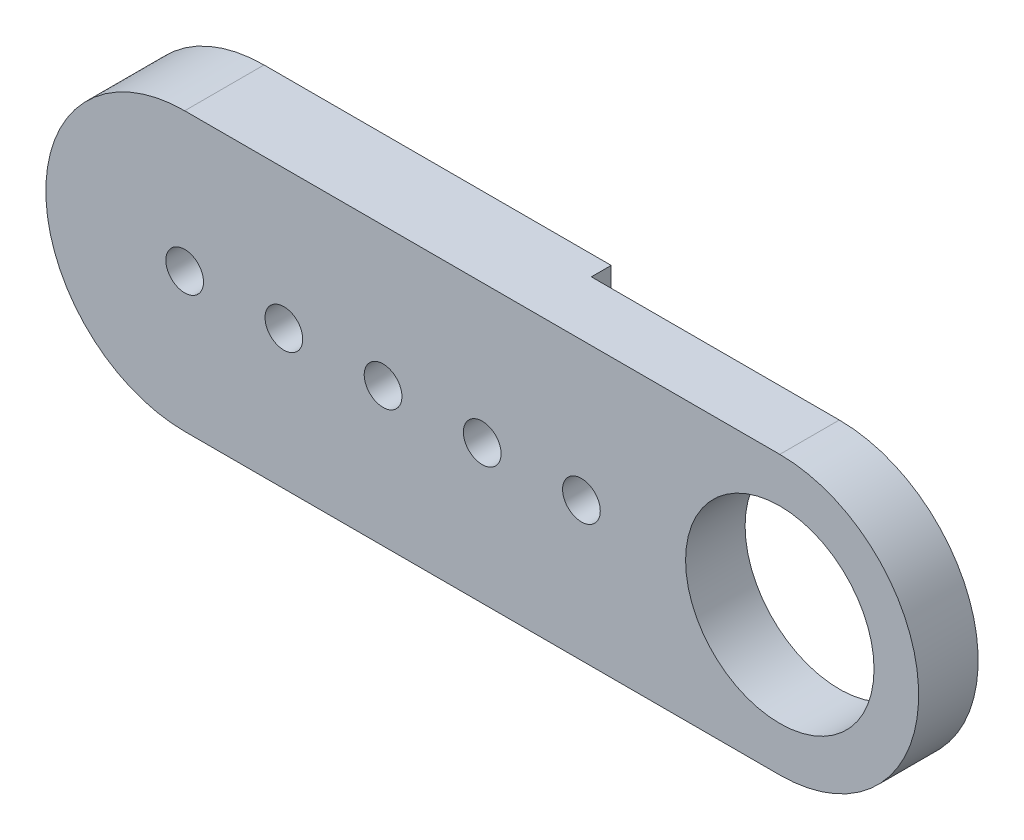
ISO-10303-21;
HEADER;
FILE_DESCRIPTION(('STEP AP214'),'2;1');
FILE_NAME('part.step','',(''),(''),'','','');
FILE_SCHEMA(('AUTOMOTIVE_DESIGN { 1 0 10303 214 1 1 1 1 }'));
ENDSEC;
DATA;
#1=APPLICATION_CONTEXT('core data for automotive mechanical design processes');
#2=APPLICATION_PROTOCOL_DEFINITION('international standard','automotive_design',2000,#1);
#3=PRODUCT_CONTEXT('',#1,'mechanical');
#4=PRODUCT('Part','Part','',(#3));
#5=PRODUCT_RELATED_PRODUCT_CATEGORY('part','',(#4));
#6=PRODUCT_DEFINITION_FORMATION('','',#4);
#7=PRODUCT_DEFINITION_CONTEXT('part definition',#1,'design');
#8=PRODUCT_DEFINITION('design','',#6,#7);
#9=PRODUCT_DEFINITION_SHAPE('','',#8);
#10=(LENGTH_UNIT() NAMED_UNIT(*) SI_UNIT(.MILLI.,.METRE.));
#11=(NAMED_UNIT(*) PLANE_ANGLE_UNIT() SI_UNIT($,.RADIAN.));
#12=(NAMED_UNIT(*) SI_UNIT($,.STERADIAN.) SOLID_ANGLE_UNIT());
#13=UNCERTAINTY_MEASURE_WITH_UNIT(LENGTH_MEASURE(1.E-05),#10,'distance_accuracy_value','');
#14=(GEOMETRIC_REPRESENTATION_CONTEXT(3) GLOBAL_UNCERTAINTY_ASSIGNED_CONTEXT((#13)) GLOBAL_UNIT_ASSIGNED_CONTEXT((#10,
#11,#12)) REPRESENTATION_CONTEXT('',''));
#15=CARTESIAN_POINT('',(0.,0.,0.));
#16=DIRECTION('',(0.,0.,1.));
#17=DIRECTION('',(1.,0.,0.));
#18=AXIS2_PLACEMENT_3D('',#15,#16,#17);
#19=CARTESIAN_POINT('',(0.,0.,8.));
#20=DIRECTION('',(0.,0.,-1.));
#21=DIRECTION('',(-1.,0.,0.));
#22=AXIS2_PLACEMENT_3D('',#19,#20,#21);
#23=CYLINDRICAL_SURFACE('',#22,14.);
#24=CARTESIAN_POINT('',(0.,0.,2.));
#25=DIRECTION('',(0.,0.,-1.));
#26=DIRECTION('',(-1.,0.,0.));
#27=AXIS2_PLACEMENT_3D('',#24,#25,#26);
#28=CIRCLE('',#27,14.);
#29=CARTESIAN_POINT('',(0.,14.,2.));
#30=VERTEX_POINT('',#29);
#31=CARTESIAN_POINT('',(0.,-14.,2.));
#32=VERTEX_POINT('',#31);
#33=EDGE_CURVE('E50',#30,#32,#28,.T.);
#34=ORIENTED_EDGE('',*,*,#33,.F.);
#35=DIRECTION('',(0.,0.,-1.));
#36=VECTOR('',#35,1.);
#37=CARTESIAN_POINT('',(0.,14.,8.));
#38=LINE('',#37,#36);
#39=CARTESIAN_POINT('',(0.,14.,8.));
#40=VERTEX_POINT('',#39);
#41=EDGE_CURVE('E11',#40,#30,#38,.T.);
#42=ORIENTED_EDGE('',*,*,#41,.F.);
#43=CARTESIAN_POINT('',(0.,0.,8.));
#44=DIRECTION('',(0.,0.,1.));
#45=DIRECTION('',(-1.,0.,0.));
#46=AXIS2_PLACEMENT_3D('',#43,#44,#45);
#47=CIRCLE('',#46,14.);
#48=CARTESIAN_POINT('',(0.,-14.,8.));
#49=VERTEX_POINT('',#48);
#50=EDGE_CURVE('E155',#49,#40,#47,.T.);
#51=ORIENTED_EDGE('',*,*,#50,.F.);
#52=DIRECTION('',(0.,0.,-1.));
#53=VECTOR('',#52,1.);
#54=CARTESIAN_POINT('',(0.,-14.,8.));
#55=LINE('',#54,#53);
#56=EDGE_CURVE('E162',#49,#32,#55,.T.);
#57=ORIENTED_EDGE('',*,*,#56,.T.);
#58=EDGE_LOOP('',(#34,#42,#51,#57));
#59=FACE_BOUND('',#58,.T.);
#60=ADVANCED_FACE('F35',(#59),#23,.T.);
#61=CARTESIAN_POINT('',(0.,0.,8.));
#62=DIRECTION('',(0.,0.,-1.));
#63=DIRECTION('',(-1.,0.,0.));
#64=AXIS2_PLACEMENT_3D('',#61,#62,#63);
#65=CYLINDRICAL_SURFACE('',#64,9.5);
#66=CARTESIAN_POINT('',(0.,0.,8.));
#67=DIRECTION('',(0.,0.,1.));
#68=DIRECTION('',(1.,0.,0.));
#69=AXIS2_PLACEMENT_3D('',#66,#67,#68);
#70=CIRCLE('',#69,9.5);
#71=CARTESIAN_POINT('',(9.5,0.,8.));
#72=VERTEX_POINT('',#71);
#73=EDGE_CURVE('E149',#72,#72,#70,.T.);
#74=ORIENTED_EDGE('',*,*,#73,.T.);
#75=EDGE_LOOP('',(#74));
#76=FACE_BOUND('',#75,.T.);
#77=CARTESIAN_POINT('',(0.,0.,2.));
#78=DIRECTION('',(0.,0.,-1.));
#79=DIRECTION('',(-1.,0.,0.));
#80=AXIS2_PLACEMENT_3D('',#77,#78,#79);
#81=CIRCLE('',#80,9.5);
#82=CARTESIAN_POINT('',(-9.5,0.,2.));
#83=VERTEX_POINT('',#82);
#84=EDGE_CURVE('E120',#83,#83,#81,.T.);
#85=ORIENTED_EDGE('',*,*,#84,.T.);
#86=EDGE_LOOP('',(#85));
#87=FACE_BOUND('',#86,.T.);
#88=ADVANCED_FACE('F200',(#76,#87),#65,.F.);
#89=CARTESIAN_POINT('',(-20.,0.,8.));
#90=DIRECTION('',(0.,0.,-1.));
#91=DIRECTION('',(-1.,0.,0.));
#92=AXIS2_PLACEMENT_3D('',#89,#90,#91);
#93=CYLINDRICAL_SURFACE('',#92,1.9);
#94=CARTESIAN_POINT('',(-20.,0.,8.));
#95=DIRECTION('',(0.,0.,1.));
#96=DIRECTION('',(1.,0.,0.));
#97=AXIS2_PLACEMENT_3D('',#94,#95,#96);
#98=CIRCLE('',#97,1.9);
#99=CARTESIAN_POINT('',(-18.1,0.,8.));
#100=VERTEX_POINT('',#99);
#101=EDGE_CURVE('E124',#100,#100,#98,.T.);
#102=ORIENTED_EDGE('',*,*,#101,.T.);
#103=EDGE_LOOP('',(#102));
#104=FACE_BOUND('',#103,.T.);
#105=CARTESIAN_POINT('',(-20.,0.,2.));
#106=DIRECTION('',(0.,0.,-1.));
#107=DIRECTION('',(-1.,0.,0.));
#108=AXIS2_PLACEMENT_3D('',#105,#106,#107);
#109=CIRCLE('',#108,1.9);
#110=CARTESIAN_POINT('',(-21.9,0.,2.));
#111=VERTEX_POINT('',#110);
#112=EDGE_CURVE('E38',#111,#111,#109,.T.);
#113=ORIENTED_EDGE('',*,*,#112,.T.);
#114=EDGE_LOOP('',(#113));
#115=FACE_BOUND('',#114,.T.);
#116=ADVANCED_FACE('F184',(#104,#115),#93,.F.);
#117=CARTESIAN_POINT('',(0.,0.,8.));
#118=DIRECTION('',(0.,0.,-1.));
#119=DIRECTION('',(-1.,0.,0.));
#120=AXIS2_PLACEMENT_3D('',#117,#118,#119);
#121=PLANE('',#120);
#122=ORIENTED_EDGE('',*,*,#50,.T.);
#123=DIRECTION('',(-1.,0.,0.));
#124=VECTOR('',#123,1.);
#125=CARTESIAN_POINT('',(0.,14.,8.));
#126=LINE('',#125,#124);
#127=CARTESIAN_POINT('',(-60.,14.,8.));
#128=VERTEX_POINT('',#127);
#129=EDGE_CURVE('E82',#40,#128,#126,.T.);
#130=ORIENTED_EDGE('',*,*,#129,.T.);
#131=CARTESIAN_POINT('',(-60.,0.,8.));
#132=DIRECTION('',(0.,0.,1.));
#133=DIRECTION('',(1.,0.,0.));
#134=AXIS2_PLACEMENT_3D('',#131,#132,#133);
#135=CIRCLE('',#134,14.);
#136=CARTESIAN_POINT('',(-60.,-14.,8.));
#137=VERTEX_POINT('',#136);
#138=EDGE_CURVE('E159',#128,#137,#135,.T.);
#139=ORIENTED_EDGE('',*,*,#138,.T.);
#140=DIRECTION('',(1.,0.,0.));
#141=VECTOR('',#140,1.);
#142=CARTESIAN_POINT('',(0.,-14.,8.));
#143=LINE('',#142,#141);
#144=EDGE_CURVE('E59',#137,#49,#143,.T.);
#145=ORIENTED_EDGE('',*,*,#144,.T.);
#146=EDGE_LOOP('',(#122,#130,#139,#145));
#147=FACE_BOUND('',#146,.T.);
#148=ORIENTED_EDGE('',*,*,#73,.F.);
#149=EDGE_LOOP('',(#148));
#150=FACE_BOUND('',#149,.T.);
#151=CARTESIAN_POINT('',(-60.,0.,8.));
#152=DIRECTION('',(0.,0.,1.));
#153=DIRECTION('',(1.,0.,0.));
#154=AXIS2_PLACEMENT_3D('',#151,#152,#153);
#155=CIRCLE('',#154,1.9);
#156=CARTESIAN_POINT('',(-58.1,0.,8.));
#157=VERTEX_POINT('',#156);
#158=EDGE_CURVE('E146',#157,#157,#155,.T.);
#159=ORIENTED_EDGE('',*,*,#158,.F.);
#160=EDGE_LOOP('',(#159));
#161=FACE_BOUND('',#160,.T.);
#162=CARTESIAN_POINT('',(-50.,0.,8.));
#163=DIRECTION('',(0.,0.,1.));
#164=DIRECTION('',(1.,0.,0.));
#165=AXIS2_PLACEMENT_3D('',#162,#163,#164);
#166=CIRCLE('',#165,1.9);
#167=CARTESIAN_POINT('',(-48.1,0.,8.));
#168=VERTEX_POINT('',#167);
#169=EDGE_CURVE('E140',#168,#168,#166,.T.);
#170=ORIENTED_EDGE('',*,*,#169,.F.);
#171=EDGE_LOOP('',(#170));
#172=FACE_BOUND('',#171,.T.);
#173=CARTESIAN_POINT('',(-40.,0.,8.));
#174=DIRECTION('',(0.,0.,1.));
#175=DIRECTION('',(1.,0.,0.));
#176=AXIS2_PLACEMENT_3D('',#173,#174,#175);
#177=CIRCLE('',#176,1.9);
#178=CARTESIAN_POINT('',(-38.1,0.,8.));
#179=VERTEX_POINT('',#178);
#180=EDGE_CURVE('E134',#179,#179,#177,.T.);
#181=ORIENTED_EDGE('',*,*,#180,.F.);
#182=EDGE_LOOP('',(#181));
#183=FACE_BOUND('',#182,.T.);
#184=CARTESIAN_POINT('',(-30.,0.,8.));
#185=DIRECTION('',(0.,0.,1.));
#186=DIRECTION('',(1.,0.,0.));
#187=AXIS2_PLACEMENT_3D('',#184,#185,#186);
#188=CIRCLE('',#187,1.9);
#189=CARTESIAN_POINT('',(-28.1,0.,8.));
#190=VERTEX_POINT('',#189);
#191=EDGE_CURVE('E128',#190,#190,#188,.T.);
#192=ORIENTED_EDGE('',*,*,#191,.F.);
#193=EDGE_LOOP('',(#192));
#194=FACE_BOUND('',#193,.T.);
#195=ORIENTED_EDGE('',*,*,#101,.F.);
#196=EDGE_LOOP('',(#195));
#197=FACE_BOUND('',#196,.T.);
#198=ADVANCED_FACE('F181',(#147,#150,#161,#172,#183,#194,#197),#121,.F.);
#199=CARTESIAN_POINT('',(0.,0.,0.));
#200=DIRECTION('',(0.,0.,-1.));
#201=DIRECTION('',(-1.,0.,0.));
#202=AXIS2_PLACEMENT_3D('',#199,#200,#201);
#203=PLANE('',#202);
#204=DIRECTION('',(0.,1.,0.));
#205=VECTOR('',#204,1.);
#206=CARTESIAN_POINT('',(-25.,-14.,0.));
#207=LINE('',#206,#205);
#208=CARTESIAN_POINT('',(-25.,-14.,0.));
#209=VERTEX_POINT('',#208);
#210=CARTESIAN_POINT('',(-25.,14.,0.));
#211=VERTEX_POINT('',#210);
#212=EDGE_CURVE('E104',#209,#211,#207,.T.);
#213=ORIENTED_EDGE('',*,*,#212,.F.);
#214=DIRECTION('',(1.,0.,0.));
#215=VECTOR('',#214,1.);
#216=CARTESIAN_POINT('',(0.,-14.,0.));
#217=LINE('',#216,#215);
#218=CARTESIAN_POINT('',(-60.,-14.,0.));
#219=VERTEX_POINT('',#218);
#220=EDGE_CURVE('E157',#219,#209,#217,.T.);
#221=ORIENTED_EDGE('',*,*,#220,.F.);
#222=CARTESIAN_POINT('',(-60.,0.,0.));
#223=DIRECTION('',(0.,0.,1.));
#224=DIRECTION('',(1.,0.,0.));
#225=AXIS2_PLACEMENT_3D('',#222,#223,#224);
#226=CIRCLE('',#225,14.);
#227=CARTESIAN_POINT('',(-60.,14.,0.));
#228=VERTEX_POINT('',#227);
#229=EDGE_CURVE('E75',#228,#219,#226,.T.);
#230=ORIENTED_EDGE('',*,*,#229,.F.);
#231=DIRECTION('',(-1.,0.,0.));
#232=VECTOR('',#231,1.);
#233=CARTESIAN_POINT('',(0.,14.,0.));
#234=LINE('',#233,#232);
#235=EDGE_CURVE('E154',#211,#228,#234,.T.);
#236=ORIENTED_EDGE('',*,*,#235,.F.);
#237=EDGE_LOOP('',(#213,#221,#230,#236));
#238=FACE_BOUND('',#237,.T.);
#239=CARTESIAN_POINT('',(-30.,0.,0.));
#240=DIRECTION('',(0.,0.,1.));
#241=DIRECTION('',(1.,0.,0.));
#242=AXIS2_PLACEMENT_3D('',#239,#240,#241);
#243=CIRCLE('',#242,1.9);
#244=CARTESIAN_POINT('',(-28.1,0.,0.));
#245=VERTEX_POINT('',#244);
#246=EDGE_CURVE('E127',#245,#245,#243,.T.);
#247=ORIENTED_EDGE('',*,*,#246,.T.);
#248=EDGE_LOOP('',(#247));
#249=FACE_BOUND('',#248,.T.);
#250=CARTESIAN_POINT('',(-50.,0.,0.));
#251=DIRECTION('',(0.,0.,1.));
#252=DIRECTION('',(1.,0.,0.));
#253=AXIS2_PLACEMENT_3D('',#250,#251,#252);
#254=CIRCLE('',#253,1.9);
#255=CARTESIAN_POINT('',(-48.1,0.,0.));
#256=VERTEX_POINT('',#255);
#257=EDGE_CURVE('E137',#256,#256,#254,.T.);
#258=ORIENTED_EDGE('',*,*,#257,.T.);
#259=EDGE_LOOP('',(#258));
#260=FACE_BOUND('',#259,.T.);
#261=CARTESIAN_POINT('',(-60.,0.,0.));
#262=DIRECTION('',(0.,0.,1.));
#263=DIRECTION('',(1.,0.,0.));
#264=AXIS2_PLACEMENT_3D('',#261,#262,#263);
#265=CIRCLE('',#264,1.9);
#266=CARTESIAN_POINT('',(-58.1,0.,0.));
#267=VERTEX_POINT('',#266);
#268=EDGE_CURVE('E143',#267,#267,#265,.T.);
#269=ORIENTED_EDGE('',*,*,#268,.T.);
#270=EDGE_LOOP('',(#269));
#271=FACE_BOUND('',#270,.T.);
#272=CARTESIAN_POINT('',(-40.,0.,0.));
#273=DIRECTION('',(0.,0.,1.));
#274=DIRECTION('',(1.,0.,0.));
#275=AXIS2_PLACEMENT_3D('',#272,#273,#274);
#276=CIRCLE('',#275,1.9);
#277=CARTESIAN_POINT('',(-38.1,0.,0.));
#278=VERTEX_POINT('',#277);
#279=EDGE_CURVE('E131',#278,#278,#276,.T.);
#280=ORIENTED_EDGE('',*,*,#279,.T.);
#281=EDGE_LOOP('',(#280));
#282=FACE_BOUND('',#281,.T.);
#283=ADVANCED_FACE('F175',(#238,#249,#260,#271,#282),#203,.T.);
#284=CARTESIAN_POINT('',(0.,14.,8.));
#285=DIRECTION('',(0.,-1.,0.));
#286=DIRECTION('',(1.,0.,0.));
#287=AXIS2_PLACEMENT_3D('',#284,#285,#286);
#288=PLANE('',#287);
#289=DIRECTION('',(1.,0.,0.));
#290=VECTOR('',#289,1.);
#291=CARTESIAN_POINT('',(-25.,14.,2.));
#292=LINE('',#291,#290);
#293=CARTESIAN_POINT('',(-25.,14.,2.));
#294=VERTEX_POINT('',#293);
#295=EDGE_CURVE('E111',#294,#30,#292,.T.);
#296=ORIENTED_EDGE('',*,*,#295,.F.);
#297=DIRECTION('',(0.,0.,-1.));
#298=VECTOR('',#297,1.);
#299=CARTESIAN_POINT('',(-25.,14.,2.));
#300=LINE('',#299,#298);
#301=EDGE_CURVE('E98',#294,#211,#300,.T.);
#302=ORIENTED_EDGE('',*,*,#301,.T.);
#303=ORIENTED_EDGE('',*,*,#235,.T.);
#304=DIRECTION('',(0.,0.,-1.));
#305=VECTOR('',#304,1.);
#306=CARTESIAN_POINT('',(-60.,14.,8.));
#307=LINE('',#306,#305);
#308=EDGE_CURVE('E43',#128,#228,#307,.T.);
#309=ORIENTED_EDGE('',*,*,#308,.F.);
#310=ORIENTED_EDGE('',*,*,#129,.F.);
#311=ORIENTED_EDGE('',*,*,#41,.T.);
#312=EDGE_LOOP('',(#296,#302,#303,#309,#310,#311));
#313=FACE_BOUND('',#312,.T.);
#314=ADVANCED_FACE('F113',(#313),#288,.F.);
#315=CARTESIAN_POINT('',(-60.,0.,8.));
#316=DIRECTION('',(0.,0.,-1.));
#317=DIRECTION('',(-1.,0.,0.));
#318=AXIS2_PLACEMENT_3D('',#315,#316,#317);
#319=CYLINDRICAL_SURFACE('',#318,14.);
#320=ORIENTED_EDGE('',*,*,#229,.T.);
#321=DIRECTION('',(0.,0.,-1.));
#322=VECTOR('',#321,1.);
#323=CARTESIAN_POINT('',(-60.,-14.,8.));
#324=LINE('',#323,#322);
#325=EDGE_CURVE('E169',#137,#219,#324,.T.);
#326=ORIENTED_EDGE('',*,*,#325,.F.);
#327=ORIENTED_EDGE('',*,*,#138,.F.);
#328=ORIENTED_EDGE('',*,*,#308,.T.);
#329=EDGE_LOOP('',(#320,#326,#327,#328));
#330=FACE_BOUND('',#329,.T.);
#331=ADVANCED_FACE('F172',(#330),#319,.T.);
#332=CARTESIAN_POINT('',(0.,-14.,8.));
#333=DIRECTION('',(0.,1.,0.));
#334=DIRECTION('',(-1.,0.,0.));
#335=AXIS2_PLACEMENT_3D('',#332,#333,#334);
#336=PLANE('',#335);
#337=ORIENTED_EDGE('',*,*,#220,.T.);
#338=DIRECTION('',(0.,0.,-1.));
#339=VECTOR('',#338,1.);
#340=CARTESIAN_POINT('',(-25.,-14.,2.));
#341=LINE('',#340,#339);
#342=CARTESIAN_POINT('',(-25.,-14.,2.));
#343=VERTEX_POINT('',#342);
#344=EDGE_CURVE('E107',#343,#209,#341,.T.);
#345=ORIENTED_EDGE('',*,*,#344,.F.);
#346=DIRECTION('',(-1.,0.,0.));
#347=VECTOR('',#346,1.);
#348=CARTESIAN_POINT('',(-25.,-14.,2.));
#349=LINE('',#348,#347);
#350=EDGE_CURVE('E108',#32,#343,#349,.T.);
#351=ORIENTED_EDGE('',*,*,#350,.F.);
#352=ORIENTED_EDGE('',*,*,#56,.F.);
#353=ORIENTED_EDGE('',*,*,#144,.F.);
#354=ORIENTED_EDGE('',*,*,#325,.T.);
#355=EDGE_LOOP('',(#337,#345,#351,#352,#353,#354));
#356=FACE_BOUND('',#355,.T.);
#357=ADVANCED_FACE('F178',(#356),#336,.F.);
#358=CARTESIAN_POINT('',(-60.,0.,8.));
#359=DIRECTION('',(0.,0.,-1.));
#360=DIRECTION('',(-1.,0.,0.));
#361=AXIS2_PLACEMENT_3D('',#358,#359,#360);
#362=CYLINDRICAL_SURFACE('',#361,1.9);
#363=ORIENTED_EDGE('',*,*,#158,.T.);
#364=EDGE_LOOP('',(#363));
#365=FACE_BOUND('',#364,.T.);
#366=ORIENTED_EDGE('',*,*,#268,.F.);
#367=EDGE_LOOP('',(#366));
#368=FACE_BOUND('',#367,.T.);
#369=ADVANCED_FACE('F228',(#365,#368),#362,.F.);
#370=CARTESIAN_POINT('',(-50.,0.,8.));
#371=DIRECTION('',(0.,0.,-1.));
#372=DIRECTION('',(-1.,0.,0.));
#373=AXIS2_PLACEMENT_3D('',#370,#371,#372);
#374=CYLINDRICAL_SURFACE('',#373,1.9);
#375=ORIENTED_EDGE('',*,*,#169,.T.);
#376=EDGE_LOOP('',(#375));
#377=FACE_BOUND('',#376,.T.);
#378=ORIENTED_EDGE('',*,*,#257,.F.);
#379=EDGE_LOOP('',(#378));
#380=FACE_BOUND('',#379,.T.);
#381=ADVANCED_FACE('F256',(#377,#380),#374,.F.);
#382=CARTESIAN_POINT('',(-40.,0.,8.));
#383=DIRECTION('',(0.,0.,-1.));
#384=DIRECTION('',(-1.,0.,0.));
#385=AXIS2_PLACEMENT_3D('',#382,#383,#384);
#386=CYLINDRICAL_SURFACE('',#385,1.9);
#387=ORIENTED_EDGE('',*,*,#180,.T.);
#388=EDGE_LOOP('',(#387));
#389=FACE_BOUND('',#388,.T.);
#390=ORIENTED_EDGE('',*,*,#279,.F.);
#391=EDGE_LOOP('',(#390));
#392=FACE_BOUND('',#391,.T.);
#393=ADVANCED_FACE('F214',(#389,#392),#386,.F.);
#394=CARTESIAN_POINT('',(-30.,0.,8.));
#395=DIRECTION('',(0.,0.,-1.));
#396=DIRECTION('',(-1.,0.,0.));
#397=AXIS2_PLACEMENT_3D('',#394,#395,#396);
#398=CYLINDRICAL_SURFACE('',#397,1.9);
#399=ORIENTED_EDGE('',*,*,#191,.T.);
#400=EDGE_LOOP('',(#399));
#401=FACE_BOUND('',#400,.T.);
#402=ORIENTED_EDGE('',*,*,#246,.F.);
#403=EDGE_LOOP('',(#402));
#404=FACE_BOUND('',#403,.T.);
#405=ADVANCED_FACE('F206',(#401,#404),#398,.F.);
#406=CARTESIAN_POINT('',(0.,0.,2.));
#407=DIRECTION('',(0.,0.,-1.));
#408=DIRECTION('',(-1.,0.,0.));
#409=AXIS2_PLACEMENT_3D('',#406,#407,#408);
#410=PLANE('',#409);
#411=ORIENTED_EDGE('',*,*,#84,.F.);
#412=EDGE_LOOP('',(#411));
#413=FACE_BOUND('',#412,.T.);
#414=ORIENTED_EDGE('',*,*,#112,.F.);
#415=EDGE_LOOP('',(#414));
#416=FACE_BOUND('',#415,.T.);
#417=ORIENTED_EDGE('',*,*,#33,.T.);
#418=ORIENTED_EDGE('',*,*,#350,.T.);
#419=DIRECTION('',(0.,1.,0.));
#420=VECTOR('',#419,1.);
#421=CARTESIAN_POINT('',(-25.,-14.,2.));
#422=LINE('',#421,#420);
#423=EDGE_CURVE('E101',#343,#294,#422,.T.);
#424=ORIENTED_EDGE('',*,*,#423,.T.);
#425=ORIENTED_EDGE('',*,*,#295,.T.);
#426=EDGE_LOOP('',(#417,#418,#424,#425));
#427=FACE_BOUND('',#426,.T.);
#428=ADVANCED_FACE('F110',(#413,#416,#427),#410,.T.);
#429=CARTESIAN_POINT('',(-25.,-14.,2.));
#430=DIRECTION('',(-1.,0.,0.));
#431=DIRECTION('',(0.,0.,1.));
#432=AXIS2_PLACEMENT_3D('',#429,#430,#431);
#433=PLANE('',#432);
#434=ORIENTED_EDGE('',*,*,#212,.T.);
#435=ORIENTED_EDGE('',*,*,#301,.F.);
#436=ORIENTED_EDGE('',*,*,#423,.F.);
#437=ORIENTED_EDGE('',*,*,#344,.T.);
#438=EDGE_LOOP('',(#434,#435,#436,#437));
#439=FACE_BOUND('',#438,.T.);
#440=ADVANCED_FACE('F100',(#439),#433,.F.);
#441=CLOSED_SHELL('',(#60,#88,#116,#198,#283,#314,#331,#357,#369,#381,#393,#405,#428,#440));
#442=MANIFOLD_SOLID_BREP('B2',#441);
#443=ADVANCED_BREP_SHAPE_REPRESENTATION('',(#18,#442),#14);
#444=SHAPE_DEFINITION_REPRESENTATION(#9,#443);
ENDSEC;
END-ISO-10303-21;
